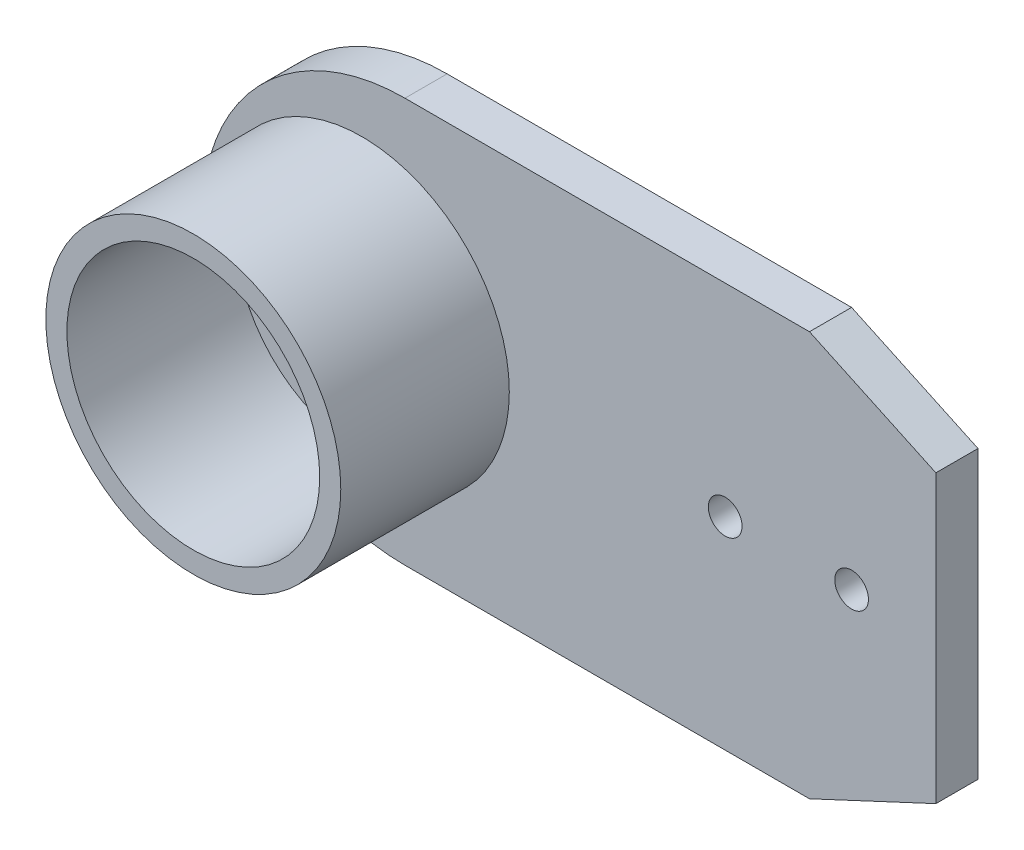
ISO-10303-21;
HEADER;
FILE_DESCRIPTION(('STEP AP214'),'2;1');
FILE_NAME('part.step','',(''),(''),'','','');
FILE_SCHEMA(('AUTOMOTIVE_DESIGN { 1 0 10303 214 1 1 1 1 }'));
ENDSEC;
DATA;
#1=APPLICATION_CONTEXT('core data for automotive mechanical design processes');
#2=APPLICATION_PROTOCOL_DEFINITION('international standard','automotive_design',2000,#1);
#3=PRODUCT_CONTEXT('',#1,'mechanical');
#4=PRODUCT('Part','Part','',(#3));
#5=PRODUCT_RELATED_PRODUCT_CATEGORY('part','',(#4));
#6=PRODUCT_DEFINITION_FORMATION('','',#4);
#7=PRODUCT_DEFINITION_CONTEXT('part definition',#1,'design');
#8=PRODUCT_DEFINITION('design','',#6,#7);
#9=PRODUCT_DEFINITION_SHAPE('','',#8);
#10=(LENGTH_UNIT() NAMED_UNIT(*) SI_UNIT(.MILLI.,.METRE.));
#11=(NAMED_UNIT(*) PLANE_ANGLE_UNIT() SI_UNIT($,.RADIAN.));
#12=(NAMED_UNIT(*) SI_UNIT($,.STERADIAN.) SOLID_ANGLE_UNIT());
#13=UNCERTAINTY_MEASURE_WITH_UNIT(LENGTH_MEASURE(1.E-05),#10,'distance_accuracy_value','');
#14=(GEOMETRIC_REPRESENTATION_CONTEXT(3) GLOBAL_UNCERTAINTY_ASSIGNED_CONTEXT((#13)) GLOBAL_UNIT_ASSIGNED_CONTEXT((#10,
#11,#12)) REPRESENTATION_CONTEXT('',''));
#15=CARTESIAN_POINT('',(0.,0.,0.));
#16=DIRECTION('',(0.,0.,1.));
#17=DIRECTION('',(1.,0.,0.));
#18=AXIS2_PLACEMENT_3D('',#15,#16,#17);
#19=CARTESIAN_POINT('',(43.5,24.,5.));
#20=DIRECTION('',(-1.,0.,0.));
#21=DIRECTION('',(0.,0.,1.));
#22=AXIS2_PLACEMENT_3D('',#19,#20,#21);
#23=PLANE('',#22);
#24=DIRECTION('',(0.,1.,0.));
#25=VECTOR('',#24,1.);
#26=CARTESIAN_POINT('',(43.5,24.,0.));
#27=LINE('',#26,#25);
#28=CARTESIAN_POINT('',(43.5,-17.,0.));
#29=VERTEX_POINT('',#28);
#30=CARTESIAN_POINT('',(43.5,17.,0.));
#31=VERTEX_POINT('',#30);
#32=EDGE_CURVE('E105',#29,#31,#27,.T.);
#33=ORIENTED_EDGE('',*,*,#32,.T.);
#34=DIRECTION('',(0.,0.,1.));
#35=VECTOR('',#34,1.);
#36=CARTESIAN_POINT('',(43.5,17.,0.));
#37=LINE('',#36,#35);
#38=CARTESIAN_POINT('',(43.5,17.,5.));
#39=VERTEX_POINT('',#38);
#40=EDGE_CURVE('E56',#31,#39,#37,.T.);
#41=ORIENTED_EDGE('',*,*,#40,.T.);
#42=DIRECTION('',(0.,1.,0.));
#43=VECTOR('',#42,1.);
#44=CARTESIAN_POINT('',(43.5,24.,5.));
#45=LINE('',#44,#43);
#46=CARTESIAN_POINT('',(43.5,-17.,5.));
#47=VERTEX_POINT('',#46);
#48=EDGE_CURVE('E114',#47,#39,#45,.T.);
#49=ORIENTED_EDGE('',*,*,#48,.F.);
#50=DIRECTION('',(0.,0.,1.));
#51=VECTOR('',#50,1.);
#52=CARTESIAN_POINT('',(43.5,-17.,0.));
#53=LINE('',#52,#51);
#54=EDGE_CURVE('E143',#29,#47,#53,.T.);
#55=ORIENTED_EDGE('',*,*,#54,.F.);
#56=EDGE_LOOP('',(#33,#41,#49,#55));
#57=FACE_BOUND('',#56,.T.);
#58=ADVANCED_FACE('F34',(#57),#23,.F.);
#59=CARTESIAN_POINT('',(-19.5,24.,5.));
#60=DIRECTION('',(0.,-1.,0.));
#61=DIRECTION('',(0.,0.,-1.));
#62=AXIS2_PLACEMENT_3D('',#59,#60,#61);
#63=PLANE('',#62);
#64=DIRECTION('',(-1.,0.,0.));
#65=VECTOR('',#64,1.);
#66=CARTESIAN_POINT('',(-19.5,24.,5.));
#67=LINE('',#66,#65);
#68=CARTESIAN_POINT('',(28.5,24.,5.));
#69=VERTEX_POINT('',#68);
#70=CARTESIAN_POINT('',(-19.5,24.,5.));
#71=VERTEX_POINT('',#70);
#72=EDGE_CURVE('E99',#69,#71,#67,.T.);
#73=ORIENTED_EDGE('',*,*,#72,.F.);
#74=DIRECTION('',(0.,0.,1.));
#75=VECTOR('',#74,1.);
#76=CARTESIAN_POINT('',(28.5,24.,0.));
#77=LINE('',#76,#75);
#78=CARTESIAN_POINT('',(28.5,24.,0.));
#79=VERTEX_POINT('',#78);
#80=EDGE_CURVE('E86',#79,#69,#77,.T.);
#81=ORIENTED_EDGE('',*,*,#80,.F.);
#82=DIRECTION('',(-1.,0.,0.));
#83=VECTOR('',#82,1.);
#84=CARTESIAN_POINT('',(-19.5,24.,0.));
#85=LINE('',#84,#83);
#86=CARTESIAN_POINT('',(-19.5,24.,0.));
#87=VERTEX_POINT('',#86);
#88=EDGE_CURVE('E98',#79,#87,#85,.T.);
#89=ORIENTED_EDGE('',*,*,#88,.T.);
#90=DIRECTION('',(0.,0.,-1.));
#91=VECTOR('',#90,1.);
#92=CARTESIAN_POINT('',(-19.5,24.,5.));
#93=LINE('',#92,#91);
#94=EDGE_CURVE('E11',#71,#87,#93,.T.);
#95=ORIENTED_EDGE('',*,*,#94,.F.);
#96=EDGE_LOOP('',(#73,#81,#89,#95));
#97=FACE_BOUND('',#96,.T.);
#98=ADVANCED_FACE('F96',(#97),#63,.F.);
#99=CARTESIAN_POINT('',(-19.5,0.,5.));
#100=DIRECTION('',(0.,0.,-1.));
#101=DIRECTION('',(-1.,0.,0.));
#102=AXIS2_PLACEMENT_3D('',#99,#100,#101);
#103=CYLINDRICAL_SURFACE('',#102,24.);
#104=CARTESIAN_POINT('',(-19.5,0.,0.));
#105=DIRECTION('',(0.,0.,1.));
#106=DIRECTION('',(1.,0.,0.));
#107=AXIS2_PLACEMENT_3D('',#104,#105,#106);
#108=CIRCLE('',#107,24.);
#109=CARTESIAN_POINT('',(-19.5,-24.,0.));
#110=VERTEX_POINT('',#109);
#111=EDGE_CURVE('E104',#87,#110,#108,.T.);
#112=ORIENTED_EDGE('',*,*,#111,.T.);
#113=DIRECTION('',(0.,0.,-1.));
#114=VECTOR('',#113,1.);
#115=CARTESIAN_POINT('',(-19.5,-24.,5.));
#116=LINE('',#115,#114);
#117=CARTESIAN_POINT('',(-19.5,-24.,5.));
#118=VERTEX_POINT('',#117);
#119=EDGE_CURVE('E41',#118,#110,#116,.T.);
#120=ORIENTED_EDGE('',*,*,#119,.F.);
#121=CARTESIAN_POINT('',(-19.5,0.,5.));
#122=DIRECTION('',(0.,0.,1.));
#123=DIRECTION('',(1.,0.,0.));
#124=AXIS2_PLACEMENT_3D('',#121,#122,#123);
#125=CIRCLE('',#124,24.);
#126=EDGE_CURVE('E121',#71,#118,#125,.T.);
#127=ORIENTED_EDGE('',*,*,#126,.F.);
#128=ORIENTED_EDGE('',*,*,#94,.T.);
#129=EDGE_LOOP('',(#112,#120,#127,#128));
#130=FACE_BOUND('',#129,.T.);
#131=ADVANCED_FACE('F218',(#130),#103,.T.);
#132=CARTESIAN_POINT('',(-19.5,-24.,5.));
#133=DIRECTION('',(0.,1.,0.));
#134=DIRECTION('',(0.,0.,1.));
#135=AXIS2_PLACEMENT_3D('',#132,#133,#134);
#136=PLANE('',#135);
#137=DIRECTION('',(1.,0.,0.));
#138=VECTOR('',#137,1.);
#139=CARTESIAN_POINT('',(-19.5,-24.,0.));
#140=LINE('',#139,#138);
#141=CARTESIAN_POINT('',(28.5,-24.,0.));
#142=VERTEX_POINT('',#141);
#143=EDGE_CURVE('E107',#110,#142,#140,.T.);
#144=ORIENTED_EDGE('',*,*,#143,.T.);
#145=DIRECTION('',(0.,0.,1.));
#146=VECTOR('',#145,1.);
#147=CARTESIAN_POINT('',(28.5,-24.,0.));
#148=LINE('',#147,#146);
#149=CARTESIAN_POINT('',(28.5,-24.,5.));
#150=VERTEX_POINT('',#149);
#151=EDGE_CURVE('E48',#142,#150,#148,.T.);
#152=ORIENTED_EDGE('',*,*,#151,.T.);
#153=DIRECTION('',(1.,0.,0.));
#154=VECTOR('',#153,1.);
#155=CARTESIAN_POINT('',(-19.5,-24.,5.));
#156=LINE('',#155,#154);
#157=EDGE_CURVE('E116',#118,#150,#156,.T.);
#158=ORIENTED_EDGE('',*,*,#157,.F.);
#159=ORIENTED_EDGE('',*,*,#119,.T.);
#160=EDGE_LOOP('',(#144,#152,#158,#159));
#161=FACE_BOUND('',#160,.T.);
#162=ADVANCED_FACE('F191',(#161),#136,.F.);
#163=CARTESIAN_POINT('',(-19.5,0.,5.));
#164=DIRECTION('',(0.,0.,1.));
#165=DIRECTION('',(1.,0.,0.));
#166=AXIS2_PLACEMENT_3D('',#163,#164,#165);
#167=PLANE('',#166);
#168=CARTESIAN_POINT('',(-24.6172987400635,0.,5.));
#169=DIRECTION('',(0.,0.,1.));
#170=DIRECTION('',(1.,0.,0.));
#171=AXIS2_PLACEMENT_3D('',#168,#169,#170);
#172=CIRCLE('',#171,17.5);
#173=CARTESIAN_POINT('',(-7.11729874006347,0.,5.));
#174=VERTEX_POINT('',#173);
#175=EDGE_CURVE('E156',#174,#174,#172,.T.);
#176=ORIENTED_EDGE('',*,*,#175,.F.);
#177=EDGE_LOOP('',(#176));
#178=FACE_BOUND('',#177,.T.);
#179=DIRECTION('',(0.906183139995265,-0.422885465331124,0.));
#180=VECTOR('',#179,1.);
#181=CARTESIAN_POINT('',(28.5,24.,5.));
#182=LINE('',#181,#180);
#183=EDGE_CURVE('E92',#69,#39,#182,.T.);
#184=ORIENTED_EDGE('',*,*,#183,.F.);
#185=ORIENTED_EDGE('',*,*,#72,.T.);
#186=ORIENTED_EDGE('',*,*,#126,.T.);
#187=ORIENTED_EDGE('',*,*,#157,.T.);
#188=DIRECTION('',(-0.906183139995265,-0.422885465331124,0.));
#189=VECTOR('',#188,1.);
#190=CARTESIAN_POINT('',(43.5,-17.,5.));
#191=LINE('',#190,#189);
#192=EDGE_CURVE('E147',#47,#150,#191,.T.);
#193=ORIENTED_EDGE('',*,*,#192,.F.);
#194=ORIENTED_EDGE('',*,*,#48,.T.);
#195=EDGE_LOOP('',(#184,#185,#186,#187,#193,#194));
#196=FACE_BOUND('',#195,.T.);
#197=CARTESIAN_POINT('',(33.5,0.,5.));
#198=DIRECTION('',(0.,0.,1.));
#199=DIRECTION('',(1.,0.,0.));
#200=AXIS2_PLACEMENT_3D('',#197,#198,#199);
#201=CIRCLE('',#200,2.);
#202=CARTESIAN_POINT('',(35.5,0.,5.));
#203=VERTEX_POINT('',#202);
#204=EDGE_CURVE('E136',#203,#203,#201,.T.);
#205=ORIENTED_EDGE('',*,*,#204,.F.);
#206=EDGE_LOOP('',(#205));
#207=FACE_BOUND('',#206,.T.);
#208=CARTESIAN_POINT('',(18.5,0.,5.));
#209=DIRECTION('',(0.,0.,1.));
#210=DIRECTION('',(1.,0.,0.));
#211=AXIS2_PLACEMENT_3D('',#208,#209,#210);
#212=CIRCLE('',#211,2.);
#213=CARTESIAN_POINT('',(20.5,0.,5.));
#214=VERTEX_POINT('',#213);
#215=EDGE_CURVE('E129',#214,#214,#212,.T.);
#216=ORIENTED_EDGE('',*,*,#215,.F.);
#217=EDGE_LOOP('',(#216));
#218=FACE_BOUND('',#217,.T.);
#219=ADVANCED_FACE('F189',(#178,#196,#207,#218),#167,.T.);
#220=CARTESIAN_POINT('',(-19.5,0.,0.));
#221=DIRECTION('',(0.,0.,1.));
#222=DIRECTION('',(1.,0.,0.));
#223=AXIS2_PLACEMENT_3D('',#220,#221,#222);
#224=PLANE('',#223);
#225=CARTESIAN_POINT('',(-24.6172987400635,0.,0.));
#226=DIRECTION('',(0.,0.,1.));
#227=DIRECTION('',(1.,0.,0.));
#228=AXIS2_PLACEMENT_3D('',#225,#226,#227);
#229=CIRCLE('',#228,5.);
#230=CARTESIAN_POINT('',(-19.6172987400635,0.,0.));
#231=VERTEX_POINT('',#230);
#232=EDGE_CURVE('E133',#231,#231,#229,.T.);
#233=ORIENTED_EDGE('',*,*,#232,.T.);
#234=EDGE_LOOP('',(#233));
#235=FACE_BOUND('',#234,.T.);
#236=CARTESIAN_POINT('',(33.5,0.,0.));
#237=DIRECTION('',(0.,0.,1.));
#238=DIRECTION('',(1.,0.,0.));
#239=AXIS2_PLACEMENT_3D('',#236,#237,#238);
#240=CIRCLE('',#239,2.);
#241=CARTESIAN_POINT('',(35.5,0.,0.));
#242=VERTEX_POINT('',#241);
#243=EDGE_CURVE('E109',#242,#242,#240,.T.);
#244=ORIENTED_EDGE('',*,*,#243,.T.);
#245=EDGE_LOOP('',(#244));
#246=FACE_BOUND('',#245,.T.);
#247=CARTESIAN_POINT('',(18.5,0.,0.));
#248=DIRECTION('',(0.,0.,1.));
#249=DIRECTION('',(1.,0.,0.));
#250=AXIS2_PLACEMENT_3D('',#247,#248,#249);
#251=CIRCLE('',#250,2.);
#252=CARTESIAN_POINT('',(20.5,0.,0.));
#253=VERTEX_POINT('',#252);
#254=EDGE_CURVE('E132',#253,#253,#251,.T.);
#255=ORIENTED_EDGE('',*,*,#254,.T.);
#256=EDGE_LOOP('',(#255));
#257=FACE_BOUND('',#256,.T.);
#258=ORIENTED_EDGE('',*,*,#88,.F.);
#259=DIRECTION('',(0.906183139995265,-0.422885465331124,0.));
#260=VECTOR('',#259,1.);
#261=CARTESIAN_POINT('',(28.5,24.,0.));
#262=LINE('',#261,#260);
#263=EDGE_CURVE('E83',#79,#31,#262,.T.);
#264=ORIENTED_EDGE('',*,*,#263,.T.);
#265=ORIENTED_EDGE('',*,*,#32,.F.);
#266=DIRECTION('',(-0.906183139995265,-0.422885465331124,0.));
#267=VECTOR('',#266,1.);
#268=CARTESIAN_POINT('',(43.5,-17.,0.));
#269=LINE('',#268,#267);
#270=EDGE_CURVE('E145',#29,#142,#269,.T.);
#271=ORIENTED_EDGE('',*,*,#270,.T.);
#272=ORIENTED_EDGE('',*,*,#143,.F.);
#273=ORIENTED_EDGE('',*,*,#111,.F.);
#274=EDGE_LOOP('',(#258,#264,#265,#271,#272,#273));
#275=FACE_BOUND('',#274,.T.);
#276=ADVANCED_FACE('F102',(#235,#246,#257,#275),#224,.F.);
#277=CARTESIAN_POINT('',(18.5,0.,0.));
#278=DIRECTION('',(0.,0.,1.));
#279=DIRECTION('',(1.,0.,0.));
#280=AXIS2_PLACEMENT_3D('',#277,#278,#279);
#281=CYLINDRICAL_SURFACE('',#280,2.);
#282=ORIENTED_EDGE('',*,*,#254,.F.);
#283=EDGE_LOOP('',(#282));
#284=FACE_BOUND('',#283,.T.);
#285=ORIENTED_EDGE('',*,*,#215,.T.);
#286=EDGE_LOOP('',(#285));
#287=FACE_BOUND('',#286,.T.);
#288=ADVANCED_FACE('F198',(#284,#287),#281,.F.);
#289=CARTESIAN_POINT('',(33.5,0.,0.));
#290=DIRECTION('',(0.,0.,1.));
#291=DIRECTION('',(1.,0.,0.));
#292=AXIS2_PLACEMENT_3D('',#289,#290,#291);
#293=CYLINDRICAL_SURFACE('',#292,2.);
#294=ORIENTED_EDGE('',*,*,#243,.F.);
#295=EDGE_LOOP('',(#294));
#296=FACE_BOUND('',#295,.T.);
#297=ORIENTED_EDGE('',*,*,#204,.T.);
#298=EDGE_LOOP('',(#297));
#299=FACE_BOUND('',#298,.T.);
#300=ADVANCED_FACE('F200',(#296,#299),#293,.F.);
#301=CARTESIAN_POINT('',(-24.6172987400635,0.,0.));
#302=DIRECTION('',(0.,0.,1.));
#303=DIRECTION('',(1.,0.,0.));
#304=AXIS2_PLACEMENT_3D('',#301,#302,#303);
#305=CYLINDRICAL_SURFACE('',#304,5.);
#306=ORIENTED_EDGE('',*,*,#232,.F.);
#307=EDGE_LOOP('',(#306));
#308=FACE_BOUND('',#307,.T.);
#309=CARTESIAN_POINT('',(-24.6172987400635,0.,5.));
#310=DIRECTION('',(0.,0.,1.));
#311=DIRECTION('',(1.,0.,0.));
#312=AXIS2_PLACEMENT_3D('',#309,#310,#311);
#313=CIRCLE('',#312,5.);
#314=CARTESIAN_POINT('',(-19.6172987400635,0.,5.));
#315=VERTEX_POINT('',#314);
#316=EDGE_CURVE('E153',#315,#315,#313,.F.);
#317=ORIENTED_EDGE('',*,*,#316,.F.);
#318=EDGE_LOOP('',(#317));
#319=FACE_BOUND('',#318,.T.);
#320=ADVANCED_FACE('F207',(#308,#319),#305,.F.);
#321=CARTESIAN_POINT('',(43.5,-17.,0.));
#322=DIRECTION('',(-0.422885465331124,0.906183139995265,0.));
#323=DIRECTION('',(-0.906183139995266,-0.422885465331124,0.));
#324=AXIS2_PLACEMENT_3D('',#321,#322,#323);
#325=PLANE('',#324);
#326=ORIENTED_EDGE('',*,*,#192,.T.);
#327=ORIENTED_EDGE('',*,*,#151,.F.);
#328=ORIENTED_EDGE('',*,*,#270,.F.);
#329=ORIENTED_EDGE('',*,*,#54,.T.);
#330=EDGE_LOOP('',(#326,#327,#328,#329));
#331=FACE_BOUND('',#330,.T.);
#332=ADVANCED_FACE('F255',(#331),#325,.F.);
#333=CARTESIAN_POINT('',(28.5,24.,0.));
#334=DIRECTION('',(-0.422885465331124,-0.906183139995265,0.));
#335=DIRECTION('',(0.906183139995266,-0.422885465331124,0.));
#336=AXIS2_PLACEMENT_3D('',#333,#334,#335);
#337=PLANE('',#336);
#338=ORIENTED_EDGE('',*,*,#183,.T.);
#339=ORIENTED_EDGE('',*,*,#40,.F.);
#340=ORIENTED_EDGE('',*,*,#263,.F.);
#341=ORIENTED_EDGE('',*,*,#80,.T.);
#342=EDGE_LOOP('',(#338,#339,#340,#341));
#343=FACE_BOUND('',#342,.T.);
#344=ADVANCED_FACE('F85',(#343),#337,.F.);
#345=CARTESIAN_POINT('',(-24.6172987400635,0.,25.));
#346=DIRECTION('',(0.,0.,-1.));
#347=DIRECTION('',(-1.,0.,0.));
#348=AXIS2_PLACEMENT_3D('',#345,#346,#347);
#349=CYLINDRICAL_SURFACE('',#348,17.5);
#350=CARTESIAN_POINT('',(-24.6172987400635,0.,25.));
#351=DIRECTION('',(0.,0.,1.));
#352=DIRECTION('',(1.,0.,0.));
#353=AXIS2_PLACEMENT_3D('',#350,#351,#352);
#354=CIRCLE('',#353,17.5);
#355=CARTESIAN_POINT('',(-7.11729874006347,0.,25.));
#356=VERTEX_POINT('',#355);
#357=EDGE_CURVE('E149',#356,#356,#354,.T.);
#358=ORIENTED_EDGE('',*,*,#357,.F.);
#359=EDGE_LOOP('',(#358));
#360=FACE_BOUND('',#359,.T.);
#361=ORIENTED_EDGE('',*,*,#175,.T.);
#362=EDGE_LOOP('',(#361));
#363=FACE_BOUND('',#362,.T.);
#364=ADVANCED_FACE('F180',(#360,#363),#349,.T.);
#365=CARTESIAN_POINT('',(-24.6172987400635,0.,25.));
#366=DIRECTION('',(0.,0.,1.));
#367=DIRECTION('',(1.,0.,0.));
#368=AXIS2_PLACEMENT_3D('',#365,#366,#367);
#369=PLANE('',#368);
#370=CARTESIAN_POINT('',(-24.6172987400635,0.,25.));
#371=DIRECTION('',(0.,0.,1.));
#372=DIRECTION('',(1.,0.,0.));
#373=AXIS2_PLACEMENT_3D('',#370,#371,#372);
#374=CIRCLE('',#373,15.);
#375=CARTESIAN_POINT('',(-9.61729874006348,0.,25.));
#376=VERTEX_POINT('',#375);
#377=EDGE_CURVE('E162',#376,#376,#374,.T.);
#378=ORIENTED_EDGE('',*,*,#377,.F.);
#379=EDGE_LOOP('',(#378));
#380=FACE_BOUND('',#379,.T.);
#381=ORIENTED_EDGE('',*,*,#357,.T.);
#382=EDGE_LOOP('',(#381));
#383=FACE_BOUND('',#382,.T.);
#384=ADVANCED_FACE('F177',(#380,#383),#369,.T.);
#385=CARTESIAN_POINT('',(-24.6172987400635,0.,5.));
#386=DIRECTION('',(0.,0.,1.));
#387=DIRECTION('',(1.,0.,0.));
#388=AXIS2_PLACEMENT_3D('',#385,#386,#387);
#389=PLANE('',#388);
#390=CARTESIAN_POINT('',(-24.6172987400635,0.,5.));
#391=DIRECTION('',(0.,0.,1.));
#392=DIRECTION('',(1.,0.,0.));
#393=AXIS2_PLACEMENT_3D('',#390,#391,#392);
#394=CIRCLE('',#393,15.);
#395=CARTESIAN_POINT('',(-9.61729874006348,0.,5.));
#396=VERTEX_POINT('',#395);
#397=EDGE_CURVE('E157',#396,#396,#394,.T.);
#398=ORIENTED_EDGE('',*,*,#397,.T.);
#399=EDGE_LOOP('',(#398));
#400=FACE_BOUND('',#399,.T.);
#401=ORIENTED_EDGE('',*,*,#316,.T.);
#402=EDGE_LOOP('',(#401));
#403=FACE_BOUND('',#402,.T.);
#404=ADVANCED_FACE('F168',(#400,#403),#389,.T.);
#405=CARTESIAN_POINT('',(-24.6172987400635,0.,5.));
#406=DIRECTION('',(0.,0.,1.));
#407=DIRECTION('',(1.,0.,0.));
#408=AXIS2_PLACEMENT_3D('',#405,#406,#407);
#409=CYLINDRICAL_SURFACE('',#408,15.);
#410=ORIENTED_EDGE('',*,*,#397,.F.);
#411=EDGE_LOOP('',(#410));
#412=FACE_BOUND('',#411,.T.);
#413=ORIENTED_EDGE('',*,*,#377,.T.);
#414=EDGE_LOOP('',(#413));
#415=FACE_BOUND('',#414,.T.);
#416=ADVANCED_FACE('F171',(#412,#415),#409,.F.);
#417=CLOSED_SHELL('',(#58,#98,#131,#162,#219,#276,#288,#300,#320,#332,#344,#364,#384,#404,#416));
#418=MANIFOLD_SOLID_BREP('B2',#417);
#419=ADVANCED_BREP_SHAPE_REPRESENTATION('',(#18,#418),#14);
#420=SHAPE_DEFINITION_REPRESENTATION(#9,#419);
ENDSEC;
END-ISO-10303-21;
